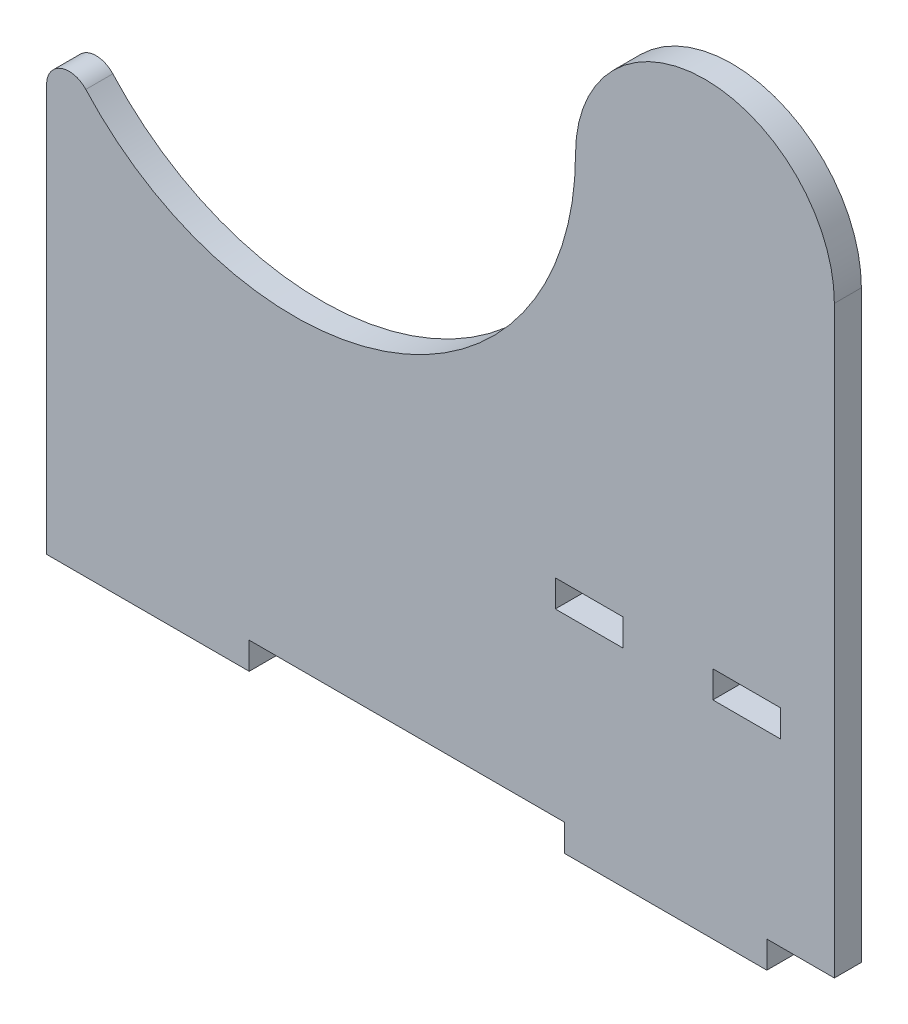
ISO-10303-21;
HEADER;
FILE_DESCRIPTION(('STEP AP214'),'2;1');
FILE_NAME('part.step','',(''),(''),'','','');
FILE_SCHEMA(('AUTOMOTIVE_DESIGN { 1 0 10303 214 1 1 1 1 }'));
ENDSEC;
DATA;
#1=APPLICATION_CONTEXT('core data for automotive mechanical design processes');
#2=APPLICATION_PROTOCOL_DEFINITION('international standard','automotive_design',2000,#1);
#3=PRODUCT_CONTEXT('',#1,'mechanical');
#4=PRODUCT('Part','Part','',(#3));
#5=PRODUCT_RELATED_PRODUCT_CATEGORY('part','',(#4));
#6=PRODUCT_DEFINITION_FORMATION('','',#4);
#7=PRODUCT_DEFINITION_CONTEXT('part definition',#1,'design');
#8=PRODUCT_DEFINITION('design','',#6,#7);
#9=PRODUCT_DEFINITION_SHAPE('','',#8);
#10=(LENGTH_UNIT() NAMED_UNIT(*) SI_UNIT(.MILLI.,.METRE.));
#11=(NAMED_UNIT(*) PLANE_ANGLE_UNIT() SI_UNIT($,.RADIAN.));
#12=(NAMED_UNIT(*) SI_UNIT($,.STERADIAN.) SOLID_ANGLE_UNIT());
#13=UNCERTAINTY_MEASURE_WITH_UNIT(LENGTH_MEASURE(1.E-05),#10,'distance_accuracy_value','');
#14=(GEOMETRIC_REPRESENTATION_CONTEXT(3) GLOBAL_UNCERTAINTY_ASSIGNED_CONTEXT((#13)) GLOBAL_UNIT_ASSIGNED_CONTEXT((#10,
#11,#12)) REPRESENTATION_CONTEXT('',''));
#15=CARTESIAN_POINT('',(0.,0.,0.));
#16=DIRECTION('',(0.,0.,1.));
#17=DIRECTION('',(1.,0.,0.));
#18=AXIS2_PLACEMENT_3D('',#15,#16,#17);
#19=CARTESIAN_POINT('',(91.2507531208354,0.,6.));
#20=DIRECTION('',(0.,0.,-1.));
#21=DIRECTION('',(-1.,0.,0.));
#22=AXIS2_PLACEMENT_3D('',#19,#20,#21);
#23=CYLINDRICAL_SURFACE('',#22,28.7507531208354);
#24=CARTESIAN_POINT('',(91.2507531208354,0.,0.));
#25=DIRECTION('',(0.,0.,1.));
#26=DIRECTION('',(-1.,0.,0.));
#27=AXIS2_PLACEMENT_3D('',#24,#25,#26);
#28=CIRCLE('',#27,28.7507531208354);
#29=CARTESIAN_POINT('',(120.001506241671,0.,0.));
#30=VERTEX_POINT('',#29);
#31=CARTESIAN_POINT('',(62.5,0.,0.));
#32=VERTEX_POINT('',#31);
#33=EDGE_CURVE('E292',#30,#32,#28,.T.);
#34=ORIENTED_EDGE('',*,*,#33,.T.);
#35=DIRECTION('',(0.,0.,-1.));
#36=VECTOR('',#35,1.);
#37=CARTESIAN_POINT('',(62.5,0.,6.));
#38=LINE('',#37,#36);
#39=CARTESIAN_POINT('',(62.5,0.,6.));
#40=VERTEX_POINT('',#39);
#41=EDGE_CURVE('E362',#40,#32,#38,.T.);
#42=ORIENTED_EDGE('',*,*,#41,.F.);
#43=CARTESIAN_POINT('',(91.2507531208354,0.,6.));
#44=DIRECTION('',(0.,0.,1.));
#45=DIRECTION('',(-1.,0.,0.));
#46=AXIS2_PLACEMENT_3D('',#43,#44,#45);
#47=CIRCLE('',#46,28.7507531208354);
#48=CARTESIAN_POINT('',(120.001506241671,0.,6.));
#49=VERTEX_POINT('',#48);
#50=EDGE_CURVE('E249',#49,#40,#47,.T.);
#51=ORIENTED_EDGE('',*,*,#50,.F.);
#52=DIRECTION('',(0.,0.,-1.));
#53=VECTOR('',#52,1.);
#54=CARTESIAN_POINT('',(120.001506241671,0.,6.));
#55=LINE('',#54,#53);
#56=EDGE_CURVE('E291',#49,#30,#55,.T.);
#57=ORIENTED_EDGE('',*,*,#56,.T.);
#58=EDGE_LOOP('',(#34,#42,#51,#57));
#59=FACE_BOUND('',#58,.T.);
#60=ADVANCED_FACE('F41',(#59),#23,.T.);
#61=CARTESIAN_POINT('',(0.,0.,6.));
#62=DIRECTION('',(0.,0.,-1.));
#63=DIRECTION('',(-1.,0.,0.));
#64=AXIS2_PLACEMENT_3D('',#61,#62,#63);
#65=CYLINDRICAL_SURFACE('',#64,62.5);
#66=CARTESIAN_POINT('',(0.,0.,0.));
#67=DIRECTION('',(0.,0.,-1.));
#68=DIRECTION('',(1.,0.,0.));
#69=AXIS2_PLACEMENT_3D('',#66,#67,#68);
#70=CIRCLE('',#69,62.5);
#71=CARTESIAN_POINT('',(-46.2949016280826,-41.9884756004091,0.));
#72=VERTEX_POINT('',#71);
#73=EDGE_CURVE('E296',#32,#72,#70,.T.);
#74=ORIENTED_EDGE('',*,*,#73,.T.);
#75=DIRECTION('',(0.,0.,-1.));
#76=VECTOR('',#75,1.);
#77=CARTESIAN_POINT('',(-46.2949016280826,-41.9884756004091,6.));
#78=LINE('',#77,#76);
#79=CARTESIAN_POINT('',(-46.2949016280826,-41.9884756004091,6.));
#80=VERTEX_POINT('',#79);
#81=EDGE_CURVE('E50',#72,#80,#78,.F.);
#82=ORIENTED_EDGE('',*,*,#81,.T.);
#83=CARTESIAN_POINT('',(0.,0.,6.));
#84=DIRECTION('',(0.,0.,-1.));
#85=DIRECTION('',(1.,0.,0.));
#86=AXIS2_PLACEMENT_3D('',#83,#84,#85);
#87=CIRCLE('',#86,62.5);
#88=EDGE_CURVE('E245',#40,#80,#87,.T.);
#89=ORIENTED_EDGE('',*,*,#88,.F.);
#90=ORIENTED_EDGE('',*,*,#41,.T.);
#91=EDGE_LOOP('',(#74,#82,#89,#90));
#92=FACE_BOUND('',#91,.T.);
#93=ADVANCED_FACE('F458',(#92),#65,.F.);
#94=CARTESIAN_POINT('',(-54.9984937583291,-129.791901429061,6.));
#95=DIRECTION('',(1.,0.,0.));
#96=DIRECTION('',(0.,1.,0.));
#97=AXIS2_PLACEMENT_3D('',#94,#95,#96);
#98=PLANE('',#97);
#99=DIRECTION('',(0.,-1.,0.));
#100=VECTOR('',#99,1.);
#101=CARTESIAN_POINT('',(-54.9984937583291,-29.6886457137241,6.));
#102=LINE('',#101,#100);
#103=CARTESIAN_POINT('',(-54.9984937583291,-45.3475536484419,6.));
#104=VERTEX_POINT('',#103);
#105=CARTESIAN_POINT('',(-54.9984937583291,-135.791901429061,6.));
#106=VERTEX_POINT('',#105);
#107=EDGE_CURVE('E248',#104,#106,#102,.T.);
#108=ORIENTED_EDGE('',*,*,#107,.F.);
#109=DIRECTION('',(0.,0.,-1.));
#110=VECTOR('',#109,1.);
#111=CARTESIAN_POINT('',(-54.9984937583292,-45.3475536484419,6.));
#112=LINE('',#111,#110);
#113=CARTESIAN_POINT('',(-54.9984937583292,-45.3475536484419,0.));
#114=VERTEX_POINT('',#113);
#115=EDGE_CURVE('E392',#104,#114,#112,.T.);
#116=ORIENTED_EDGE('',*,*,#115,.T.);
#117=DIRECTION('',(0.,-1.,0.));
#118=VECTOR('',#117,1.);
#119=CARTESIAN_POINT('',(-54.9984937583291,-129.791901429061,0.));
#120=LINE('',#119,#118);
#121=CARTESIAN_POINT('',(-54.9984937583291,-135.791901429061,0.));
#122=VERTEX_POINT('',#121);
#123=EDGE_CURVE('E300',#114,#122,#120,.T.);
#124=ORIENTED_EDGE('',*,*,#123,.T.);
#125=DIRECTION('',(0.,0.,-1.));
#126=VECTOR('',#125,1.);
#127=CARTESIAN_POINT('',(-54.9984937583291,-135.791901429061,6.));
#128=LINE('',#127,#126);
#129=EDGE_CURVE('E358',#106,#122,#128,.T.);
#130=ORIENTED_EDGE('',*,*,#129,.F.);
#131=EDGE_LOOP('',(#108,#116,#124,#130));
#132=FACE_BOUND('',#131,.T.);
#133=ADVANCED_FACE('F464',(#132),#98,.F.);
#134=CARTESIAN_POINT('',(-54.9984937583291,-135.791901429061,6.));
#135=DIRECTION('',(0.,1.,0.));
#136=DIRECTION('',(-1.,0.,0.));
#137=AXIS2_PLACEMENT_3D('',#134,#135,#136);
#138=PLANE('',#137);
#139=DIRECTION('',(1.,0.,0.));
#140=VECTOR('',#139,1.);
#141=CARTESIAN_POINT('',(-54.9984937583291,-135.791901429061,0.));
#142=LINE('',#141,#140);
#143=CARTESIAN_POINT('',(-9.99849375832913,-135.791901429061,0.));
#144=VERTEX_POINT('',#143);
#145=EDGE_CURVE('E303',#122,#144,#142,.T.);
#146=ORIENTED_EDGE('',*,*,#145,.T.);
#147=DIRECTION('',(0.,0.,-1.));
#148=VECTOR('',#147,1.);
#149=CARTESIAN_POINT('',(-9.99849375832913,-135.791901429061,6.));
#150=LINE('',#149,#148);
#151=CARTESIAN_POINT('',(-9.99849375832913,-135.791901429061,6.));
#152=VERTEX_POINT('',#151);
#153=EDGE_CURVE('E354',#152,#144,#150,.T.);
#154=ORIENTED_EDGE('',*,*,#153,.F.);
#155=DIRECTION('',(1.,0.,0.));
#156=VECTOR('',#155,1.);
#157=CARTESIAN_POINT('',(-54.9984937583291,-135.791901429061,6.));
#158=LINE('',#157,#156);
#159=EDGE_CURVE('E255',#106,#152,#158,.T.);
#160=ORIENTED_EDGE('',*,*,#159,.F.);
#161=ORIENTED_EDGE('',*,*,#129,.T.);
#162=EDGE_LOOP('',(#146,#154,#160,#161));
#163=FACE_BOUND('',#162,.T.);
#164=ADVANCED_FACE('F469',(#163),#138,.F.);
#165=CARTESIAN_POINT('',(-9.99849375832913,-129.791901429061,6.));
#166=DIRECTION('',(-1.,0.,0.));
#167=DIRECTION('',(0.,0.,1.));
#168=AXIS2_PLACEMENT_3D('',#165,#166,#167);
#169=PLANE('',#168);
#170=DIRECTION('',(0.,1.,0.));
#171=VECTOR('',#170,1.);
#172=CARTESIAN_POINT('',(-9.99849375832913,-129.791901429061,0.));
#173=LINE('',#172,#171);
#174=CARTESIAN_POINT('',(-9.99849375832913,-129.791901429061,0.));
#175=VERTEX_POINT('',#174);
#176=EDGE_CURVE('E306',#144,#175,#173,.T.);
#177=ORIENTED_EDGE('',*,*,#176,.T.);
#178=DIRECTION('',(0.,0.,-1.));
#179=VECTOR('',#178,1.);
#180=CARTESIAN_POINT('',(-9.99849375832913,-129.791901429061,6.));
#181=LINE('',#180,#179);
#182=CARTESIAN_POINT('',(-9.99849375832913,-129.791901429061,6.));
#183=VERTEX_POINT('',#182);
#184=EDGE_CURVE('E350',#183,#175,#181,.T.);
#185=ORIENTED_EDGE('',*,*,#184,.F.);
#186=DIRECTION('',(0.,1.,0.));
#187=VECTOR('',#186,1.);
#188=CARTESIAN_POINT('',(-9.99849375832913,-129.791901429061,6.));
#189=LINE('',#188,#187);
#190=EDGE_CURVE('E259',#152,#183,#189,.T.);
#191=ORIENTED_EDGE('',*,*,#190,.F.);
#192=ORIENTED_EDGE('',*,*,#153,.T.);
#193=EDGE_LOOP('',(#177,#185,#191,#192));
#194=FACE_BOUND('',#193,.T.);
#195=ADVANCED_FACE('F473',(#194),#169,.F.);
#196=CARTESIAN_POINT('',(60.0015062416709,-129.791901429061,6.));
#197=DIRECTION('',(0.,1.,0.));
#198=DIRECTION('',(0.,0.,1.));
#199=AXIS2_PLACEMENT_3D('',#196,#197,#198);
#200=PLANE('',#199);
#201=DIRECTION('',(1.,0.,0.));
#202=VECTOR('',#201,1.);
#203=CARTESIAN_POINT('',(60.0015062416709,-129.791901429061,0.));
#204=LINE('',#203,#202);
#205=CARTESIAN_POINT('',(60.0015062416709,-129.791901429061,0.));
#206=VERTEX_POINT('',#205);
#207=EDGE_CURVE('E309',#175,#206,#204,.T.);
#208=ORIENTED_EDGE('',*,*,#207,.T.);
#209=DIRECTION('',(0.,0.,-1.));
#210=VECTOR('',#209,1.);
#211=CARTESIAN_POINT('',(60.0015062416709,-129.791901429061,6.));
#212=LINE('',#211,#210);
#213=CARTESIAN_POINT('',(60.0015062416709,-129.791901429061,6.));
#214=VERTEX_POINT('',#213);
#215=EDGE_CURVE('E346',#214,#206,#212,.T.);
#216=ORIENTED_EDGE('',*,*,#215,.F.);
#217=DIRECTION('',(1.,0.,0.));
#218=VECTOR('',#217,1.);
#219=CARTESIAN_POINT('',(60.0015062416709,-129.791901429061,6.));
#220=LINE('',#219,#218);
#221=EDGE_CURVE('E267',#183,#214,#220,.T.);
#222=ORIENTED_EDGE('',*,*,#221,.F.);
#223=ORIENTED_EDGE('',*,*,#184,.T.);
#224=EDGE_LOOP('',(#208,#216,#222,#223));
#225=FACE_BOUND('',#224,.T.);
#226=ADVANCED_FACE('F477',(#225),#200,.F.);
#227=CARTESIAN_POINT('',(60.0015062416709,-129.791901429061,6.));
#228=DIRECTION('',(1.,0.,0.));
#229=DIRECTION('',(0.,0.,-1.));
#230=AXIS2_PLACEMENT_3D('',#227,#228,#229);
#231=PLANE('',#230);
#232=DIRECTION('',(0.,-1.,0.));
#233=VECTOR('',#232,1.);
#234=CARTESIAN_POINT('',(60.0015062416709,-129.791901429061,0.));
#235=LINE('',#234,#233);
#236=CARTESIAN_POINT('',(60.0015062416709,-135.791901429061,0.));
#237=VERTEX_POINT('',#236);
#238=EDGE_CURVE('E312',#206,#237,#235,.T.);
#239=ORIENTED_EDGE('',*,*,#238,.T.);
#240=DIRECTION('',(0.,0.,-1.));
#241=VECTOR('',#240,1.);
#242=CARTESIAN_POINT('',(60.0015062416709,-135.791901429061,6.));
#243=LINE('',#242,#241);
#244=CARTESIAN_POINT('',(60.0015062416709,-135.791901429061,6.));
#245=VERTEX_POINT('',#244);
#246=EDGE_CURVE('E342',#245,#237,#243,.T.);
#247=ORIENTED_EDGE('',*,*,#246,.F.);
#248=DIRECTION('',(0.,-1.,0.));
#249=VECTOR('',#248,1.);
#250=CARTESIAN_POINT('',(60.0015062416709,-129.791901429061,6.));
#251=LINE('',#250,#249);
#252=EDGE_CURVE('E270',#214,#245,#251,.T.);
#253=ORIENTED_EDGE('',*,*,#252,.F.);
#254=ORIENTED_EDGE('',*,*,#215,.T.);
#255=EDGE_LOOP('',(#239,#247,#253,#254));
#256=FACE_BOUND('',#255,.T.);
#257=ADVANCED_FACE('F481',(#256),#231,.F.);
#258=CARTESIAN_POINT('',(105.001506241671,-135.791901429061,6.));
#259=DIRECTION('',(0.,1.,0.));
#260=DIRECTION('',(-1.,0.,0.));
#261=AXIS2_PLACEMENT_3D('',#258,#259,#260);
#262=PLANE('',#261);
#263=DIRECTION('',(1.,0.,0.));
#264=VECTOR('',#263,1.);
#265=CARTESIAN_POINT('',(105.001506241671,-135.791901429061,0.));
#266=LINE('',#265,#264);
#267=CARTESIAN_POINT('',(105.001506241671,-135.791901429061,0.));
#268=VERTEX_POINT('',#267);
#269=EDGE_CURVE('E315',#237,#268,#266,.T.);
#270=ORIENTED_EDGE('',*,*,#269,.T.);
#271=DIRECTION('',(0.,0.,-1.));
#272=VECTOR('',#271,1.);
#273=CARTESIAN_POINT('',(105.001506241671,-135.791901429061,6.));
#274=LINE('',#273,#272);
#275=CARTESIAN_POINT('',(105.001506241671,-135.791901429061,6.));
#276=VERTEX_POINT('',#275);
#277=EDGE_CURVE('E338',#276,#268,#274,.T.);
#278=ORIENTED_EDGE('',*,*,#277,.F.);
#279=DIRECTION('',(1.,0.,0.));
#280=VECTOR('',#279,1.);
#281=CARTESIAN_POINT('',(105.001506241671,-135.791901429061,6.));
#282=LINE('',#281,#280);
#283=EDGE_CURVE('E274',#245,#276,#282,.T.);
#284=ORIENTED_EDGE('',*,*,#283,.F.);
#285=ORIENTED_EDGE('',*,*,#246,.T.);
#286=EDGE_LOOP('',(#270,#278,#284,#285));
#287=FACE_BOUND('',#286,.T.);
#288=ADVANCED_FACE('F485',(#287),#262,.F.);
#289=CARTESIAN_POINT('',(105.001506241671,-129.791901429061,6.));
#290=DIRECTION('',(-1.,0.,0.));
#291=DIRECTION('',(0.,0.,1.));
#292=AXIS2_PLACEMENT_3D('',#289,#290,#291);
#293=PLANE('',#292);
#294=DIRECTION('',(0.,1.,0.));
#295=VECTOR('',#294,1.);
#296=CARTESIAN_POINT('',(105.001506241671,-129.791901429061,0.));
#297=LINE('',#296,#295);
#298=CARTESIAN_POINT('',(105.001506241671,-129.791901429061,0.));
#299=VERTEX_POINT('',#298);
#300=EDGE_CURVE('E318',#268,#299,#297,.T.);
#301=ORIENTED_EDGE('',*,*,#300,.T.);
#302=DIRECTION('',(0.,0.,-1.));
#303=VECTOR('',#302,1.);
#304=CARTESIAN_POINT('',(105.001506241671,-129.791901429061,6.));
#305=LINE('',#304,#303);
#306=CARTESIAN_POINT('',(105.001506241671,-129.791901429061,6.));
#307=VERTEX_POINT('',#306);
#308=EDGE_CURVE('E334',#307,#299,#305,.T.);
#309=ORIENTED_EDGE('',*,*,#308,.F.);
#310=DIRECTION('',(0.,1.,0.));
#311=VECTOR('',#310,1.);
#312=CARTESIAN_POINT('',(105.001506241671,-129.791901429061,6.));
#313=LINE('',#312,#311);
#314=EDGE_CURVE('E278',#276,#307,#313,.T.);
#315=ORIENTED_EDGE('',*,*,#314,.F.);
#316=ORIENTED_EDGE('',*,*,#277,.T.);
#317=EDGE_LOOP('',(#301,#309,#315,#316));
#318=FACE_BOUND('',#317,.T.);
#319=ADVANCED_FACE('F489',(#318),#293,.F.);
#320=CARTESIAN_POINT('',(105.001506241671,-129.791901429061,6.));
#321=DIRECTION('',(0.,1.,0.));
#322=DIRECTION('',(0.,0.,1.));
#323=AXIS2_PLACEMENT_3D('',#320,#321,#322);
#324=PLANE('',#323);
#325=DIRECTION('',(1.,0.,0.));
#326=VECTOR('',#325,1.);
#327=CARTESIAN_POINT('',(105.001506241671,-129.791901429061,0.));
#328=LINE('',#327,#326);
#329=CARTESIAN_POINT('',(120.001506241671,-129.791901429061,0.));
#330=VERTEX_POINT('',#329);
#331=EDGE_CURVE('E321',#299,#330,#328,.T.);
#332=ORIENTED_EDGE('',*,*,#331,.T.);
#333=DIRECTION('',(0.,0.,-1.));
#334=VECTOR('',#333,1.);
#335=CARTESIAN_POINT('',(120.001506241671,-129.791901429061,6.));
#336=LINE('',#335,#334);
#337=CARTESIAN_POINT('',(120.001506241671,-129.791901429061,6.));
#338=VERTEX_POINT('',#337);
#339=EDGE_CURVE('E330',#338,#330,#336,.T.);
#340=ORIENTED_EDGE('',*,*,#339,.F.);
#341=DIRECTION('',(1.,0.,0.));
#342=VECTOR('',#341,1.);
#343=CARTESIAN_POINT('',(105.001506241671,-129.791901429061,6.));
#344=LINE('',#343,#342);
#345=EDGE_CURVE('E284',#307,#338,#344,.T.);
#346=ORIENTED_EDGE('',*,*,#345,.F.);
#347=ORIENTED_EDGE('',*,*,#308,.T.);
#348=EDGE_LOOP('',(#332,#340,#346,#347));
#349=FACE_BOUND('',#348,.T.);
#350=ADVANCED_FACE('F493',(#349),#324,.F.);
#351=CARTESIAN_POINT('',(120.001506241671,-129.791901429061,6.));
#352=DIRECTION('',(-1.,0.,0.));
#353=DIRECTION('',(0.,0.,1.));
#354=AXIS2_PLACEMENT_3D('',#351,#352,#353);
#355=PLANE('',#354);
#356=DIRECTION('',(0.,1.,0.));
#357=VECTOR('',#356,1.);
#358=CARTESIAN_POINT('',(120.001506241671,-129.791901429061,0.));
#359=LINE('',#358,#357);
#360=EDGE_CURVE('E324',#330,#30,#359,.T.);
#361=ORIENTED_EDGE('',*,*,#360,.T.);
#362=ORIENTED_EDGE('',*,*,#56,.F.);
#363=DIRECTION('',(0.,1.,0.));
#364=VECTOR('',#363,1.);
#365=CARTESIAN_POINT('',(120.001506241671,-129.791901429061,6.));
#366=LINE('',#365,#364);
#367=EDGE_CURVE('E287',#338,#49,#366,.T.);
#368=ORIENTED_EDGE('',*,*,#367,.F.);
#369=ORIENTED_EDGE('',*,*,#339,.T.);
#370=EDGE_LOOP('',(#361,#362,#368,#369));
#371=FACE_BOUND('',#370,.T.);
#372=ADVANCED_FACE('F497',(#371),#355,.F.);
#373=CARTESIAN_POINT('',(91.2507531208354,0.,6.));
#374=DIRECTION('',(0.,0.,-1.));
#375=DIRECTION('',(-1.,0.,0.));
#376=AXIS2_PLACEMENT_3D('',#373,#374,#375);
#377=PLANE('',#376);
#378=DIRECTION('',(0.,-1.,0.));
#379=VECTOR('',#378,1.);
#380=CARTESIAN_POINT('',(58.0015062416708,0.,6.));
#381=LINE('',#380,#379);
#382=CARTESIAN_POINT('',(58.0015062416708,-83.7919014290615,6.));
#383=VERTEX_POINT('',#382);
#384=CARTESIAN_POINT('',(58.0015062416708,-89.7919014290615,6.));
#385=VERTEX_POINT('',#384);
#386=EDGE_CURVE('E194',#383,#385,#381,.T.);
#387=ORIENTED_EDGE('',*,*,#386,.F.);
#388=DIRECTION('',(-1.,0.,0.));
#389=VECTOR('',#388,1.);
#390=CARTESIAN_POINT('',(0.,-83.7919014290615,6.));
#391=LINE('',#390,#389);
#392=CARTESIAN_POINT('',(73.0015062416708,-83.7919014290615,6.));
#393=VERTEX_POINT('',#392);
#394=EDGE_CURVE('E200',#393,#383,#391,.T.);
#395=ORIENTED_EDGE('',*,*,#394,.F.);
#396=DIRECTION('',(0.,-1.,0.));
#397=VECTOR('',#396,1.);
#398=CARTESIAN_POINT('',(73.0015062416708,0.,6.));
#399=LINE('',#398,#397);
#400=CARTESIAN_POINT('',(73.0015062416708,-89.7919014290615,6.));
#401=VERTEX_POINT('',#400);
#402=EDGE_CURVE('E205',#393,#401,#399,.T.);
#403=ORIENTED_EDGE('',*,*,#402,.T.);
#404=DIRECTION('',(-1.,0.,0.));
#405=VECTOR('',#404,1.);
#406=CARTESIAN_POINT('',(0.,-89.7919014290615,6.));
#407=LINE('',#406,#405);
#408=EDGE_CURVE('E182',#401,#385,#407,.T.);
#409=ORIENTED_EDGE('',*,*,#408,.T.);
#410=EDGE_LOOP('',(#387,#395,#403,#409));
#411=FACE_BOUND('',#410,.T.);
#412=DIRECTION('',(0.,-1.,0.));
#413=VECTOR('',#412,1.);
#414=CARTESIAN_POINT('',(93.0015062416709,0.,6.));
#415=LINE('',#414,#413);
#416=CARTESIAN_POINT('',(93.0015062416709,-83.7919014290615,6.));
#417=VERTEX_POINT('',#416);
#418=CARTESIAN_POINT('',(93.0015062416709,-89.7919014290615,6.));
#419=VERTEX_POINT('',#418);
#420=EDGE_CURVE('E223',#417,#419,#415,.T.);
#421=ORIENTED_EDGE('',*,*,#420,.F.);
#422=DIRECTION('',(-1.,0.,0.));
#423=VECTOR('',#422,1.);
#424=CARTESIAN_POINT('',(0.,-83.7919014290615,6.));
#425=LINE('',#424,#423);
#426=CARTESIAN_POINT('',(108.001506241671,-83.7919014290615,6.));
#427=VERTEX_POINT('',#426);
#428=EDGE_CURVE('E229',#427,#417,#425,.T.);
#429=ORIENTED_EDGE('',*,*,#428,.F.);
#430=DIRECTION('',(0.,-1.,0.));
#431=VECTOR('',#430,1.);
#432=CARTESIAN_POINT('',(108.001506241671,0.,6.));
#433=LINE('',#432,#431);
#434=CARTESIAN_POINT('',(108.001506241671,-89.7919014290615,6.));
#435=VERTEX_POINT('',#434);
#436=EDGE_CURVE('E236',#427,#435,#433,.T.);
#437=ORIENTED_EDGE('',*,*,#436,.T.);
#438=DIRECTION('',(-1.,0.,0.));
#439=VECTOR('',#438,1.);
#440=CARTESIAN_POINT('',(0.,-89.7919014290615,6.));
#441=LINE('',#440,#439);
#442=EDGE_CURVE('E228',#435,#419,#441,.T.);
#443=ORIENTED_EDGE('',*,*,#442,.T.);
#444=EDGE_LOOP('',(#421,#429,#437,#443));
#445=FACE_BOUND('',#444,.T.);
#446=ORIENTED_EDGE('',*,*,#88,.T.);
#447=CARTESIAN_POINT('',(-49.9984937583292,-45.3475536484419,6.));
#448=DIRECTION('',(0.,0.,-1.));
#449=DIRECTION('',(-1.,0.,0.));
#450=AXIS2_PLACEMENT_3D('',#447,#448,#449);
#451=CIRCLE('',#450,5.);
#452=EDGE_CURVE('E12',#80,#104,#451,.F.);
#453=ORIENTED_EDGE('',*,*,#452,.T.);
#454=ORIENTED_EDGE('',*,*,#107,.T.);
#455=ORIENTED_EDGE('',*,*,#159,.T.);
#456=ORIENTED_EDGE('',*,*,#190,.T.);
#457=ORIENTED_EDGE('',*,*,#221,.T.);
#458=ORIENTED_EDGE('',*,*,#252,.T.);
#459=ORIENTED_EDGE('',*,*,#283,.T.);
#460=ORIENTED_EDGE('',*,*,#314,.T.);
#461=ORIENTED_EDGE('',*,*,#345,.T.);
#462=ORIENTED_EDGE('',*,*,#367,.T.);
#463=ORIENTED_EDGE('',*,*,#50,.T.);
#464=EDGE_LOOP('',(#446,#453,#454,#455,#456,#457,#458,#459,#460,#461,#462,#463));
#465=FACE_BOUND('',#464,.T.);
#466=ADVANCED_FACE('F202',(#411,#445,#465),#377,.F.);
#467=CARTESIAN_POINT('',(91.2507531208354,0.,0.));
#468=DIRECTION('',(0.,0.,-1.));
#469=DIRECTION('',(-1.,0.,0.));
#470=AXIS2_PLACEMENT_3D('',#467,#468,#469);
#471=PLANE('',#470);
#472=DIRECTION('',(1.,0.,0.));
#473=VECTOR('',#472,1.);
#474=CARTESIAN_POINT('',(91.2507531208354,-83.7919014290615,0.));
#475=LINE('',#474,#473);
#476=CARTESIAN_POINT('',(58.0015062416708,-83.7919014290615,0.));
#477=VERTEX_POINT('',#476);
#478=CARTESIAN_POINT('',(73.0015062416708,-83.7919014290615,0.));
#479=VERTEX_POINT('',#478);
#480=EDGE_CURVE('E389',#477,#479,#475,.T.);
#481=ORIENTED_EDGE('',*,*,#480,.F.);
#482=DIRECTION('',(0.,1.,0.));
#483=VECTOR('',#482,1.);
#484=CARTESIAN_POINT('',(58.0015062416708,0.,0.));
#485=LINE('',#484,#483);
#486=CARTESIAN_POINT('',(58.0015062416708,-89.7919014290615,0.));
#487=VERTEX_POINT('',#486);
#488=EDGE_CURVE('E380',#487,#477,#485,.T.);
#489=ORIENTED_EDGE('',*,*,#488,.F.);
#490=DIRECTION('',(1.,0.,0.));
#491=VECTOR('',#490,1.);
#492=CARTESIAN_POINT('',(91.2507531208354,-89.7919014290615,0.));
#493=LINE('',#492,#491);
#494=CARTESIAN_POINT('',(73.0015062416708,-89.7919014290615,0.));
#495=VERTEX_POINT('',#494);
#496=EDGE_CURVE('E185',#487,#495,#493,.T.);
#497=ORIENTED_EDGE('',*,*,#496,.T.);
#498=DIRECTION('',(0.,1.,0.));
#499=VECTOR('',#498,1.);
#500=CARTESIAN_POINT('',(73.0015062416708,0.,0.));
#501=LINE('',#500,#499);
#502=EDGE_CURVE('E385',#495,#479,#501,.T.);
#503=ORIENTED_EDGE('',*,*,#502,.T.);
#504=EDGE_LOOP('',(#481,#489,#497,#503));
#505=FACE_BOUND('',#504,.T.);
#506=DIRECTION('',(1.,0.,0.));
#507=VECTOR('',#506,1.);
#508=CARTESIAN_POINT('',(91.2507531208354,-83.7919014290615,0.));
#509=LINE('',#508,#507);
#510=CARTESIAN_POINT('',(93.0015062416709,-83.7919014290615,0.));
#511=VERTEX_POINT('',#510);
#512=CARTESIAN_POINT('',(108.001506241671,-83.7919014290615,0.));
#513=VERTEX_POINT('',#512);
#514=EDGE_CURVE('E377',#511,#513,#509,.T.);
#515=ORIENTED_EDGE('',*,*,#514,.F.);
#516=DIRECTION('',(0.,1.,0.));
#517=VECTOR('',#516,1.);
#518=CARTESIAN_POINT('',(93.0015062416709,0.,0.));
#519=LINE('',#518,#517);
#520=CARTESIAN_POINT('',(93.0015062416709,-89.7919014290615,0.));
#521=VERTEX_POINT('',#520);
#522=EDGE_CURVE('E366',#521,#511,#519,.T.);
#523=ORIENTED_EDGE('',*,*,#522,.F.);
#524=DIRECTION('',(1.,0.,0.));
#525=VECTOR('',#524,1.);
#526=CARTESIAN_POINT('',(91.2507531208354,-89.7919014290615,0.));
#527=LINE('',#526,#525);
#528=CARTESIAN_POINT('',(108.001506241671,-89.7919014290615,0.));
#529=VERTEX_POINT('',#528);
#530=EDGE_CURVE('E369',#521,#529,#527,.T.);
#531=ORIENTED_EDGE('',*,*,#530,.T.);
#532=DIRECTION('',(0.,1.,0.));
#533=VECTOR('',#532,1.);
#534=CARTESIAN_POINT('',(108.001506241671,0.,0.));
#535=LINE('',#534,#533);
#536=EDGE_CURVE('E373',#529,#513,#535,.T.);
#537=ORIENTED_EDGE('',*,*,#536,.T.);
#538=EDGE_LOOP('',(#515,#523,#531,#537));
#539=FACE_BOUND('',#538,.T.);
#540=ORIENTED_EDGE('',*,*,#123,.F.);
#541=CARTESIAN_POINT('',(-49.9984937583292,-45.3475536484419,0.));
#542=DIRECTION('',(0.,0.,-1.));
#543=DIRECTION('',(-1.,0.,0.));
#544=AXIS2_PLACEMENT_3D('',#541,#542,#543);
#545=CIRCLE('',#544,5.);
#546=EDGE_CURVE('E64',#114,#72,#545,.T.);
#547=ORIENTED_EDGE('',*,*,#546,.T.);
#548=ORIENTED_EDGE('',*,*,#73,.F.);
#549=ORIENTED_EDGE('',*,*,#33,.F.);
#550=ORIENTED_EDGE('',*,*,#360,.F.);
#551=ORIENTED_EDGE('',*,*,#331,.F.);
#552=ORIENTED_EDGE('',*,*,#300,.F.);
#553=ORIENTED_EDGE('',*,*,#269,.F.);
#554=ORIENTED_EDGE('',*,*,#238,.F.);
#555=ORIENTED_EDGE('',*,*,#207,.F.);
#556=ORIENTED_EDGE('',*,*,#176,.F.);
#557=ORIENTED_EDGE('',*,*,#145,.F.);
#558=EDGE_LOOP('',(#540,#547,#548,#549,#550,#551,#552,#553,#554,#555,#556,#557));
#559=FACE_BOUND('',#558,.T.);
#560=ADVANCED_FACE('F411',(#505,#539,#559),#471,.T.);
#561=CARTESIAN_POINT('',(0.,-83.7919014290615,-4.));
#562=DIRECTION('',(0.,1.,0.));
#563=DIRECTION('',(0.,0.,1.));
#564=AXIS2_PLACEMENT_3D('',#561,#562,#563);
#565=PLANE('',#564);
#566=ORIENTED_EDGE('',*,*,#514,.T.);
#567=DIRECTION('',(0.,0.,1.));
#568=VECTOR('',#567,1.);
#569=CARTESIAN_POINT('',(108.001506241671,-83.7919014290615,-4.));
#570=LINE('',#569,#568);
#571=EDGE_CURVE('E416',#513,#427,#570,.T.);
#572=ORIENTED_EDGE('',*,*,#571,.T.);
#573=ORIENTED_EDGE('',*,*,#428,.T.);
#574=DIRECTION('',(0.,0.,1.));
#575=VECTOR('',#574,1.);
#576=CARTESIAN_POINT('',(93.0015062416709,-83.7919014290615,-4.));
#577=LINE('',#576,#575);
#578=EDGE_CURVE('E429',#511,#417,#577,.T.);
#579=ORIENTED_EDGE('',*,*,#578,.F.);
#580=EDGE_LOOP('',(#566,#572,#573,#579));
#581=FACE_BOUND('',#580,.T.);
#582=ADVANCED_FACE('F504',(#581),#565,.F.);
#583=CARTESIAN_POINT('',(108.001506241671,0.,-4.));
#584=DIRECTION('',(-1.,0.,0.));
#585=DIRECTION('',(0.,0.,1.));
#586=AXIS2_PLACEMENT_3D('',#583,#584,#585);
#587=PLANE('',#586);
#588=DIRECTION('',(0.,0.,1.));
#589=VECTOR('',#588,1.);
#590=CARTESIAN_POINT('',(108.001506241671,-89.7919014290615,-4.));
#591=LINE('',#590,#589);
#592=EDGE_CURVE('E418',#529,#435,#591,.T.);
#593=ORIENTED_EDGE('',*,*,#592,.T.);
#594=ORIENTED_EDGE('',*,*,#436,.F.);
#595=ORIENTED_EDGE('',*,*,#571,.F.);
#596=ORIENTED_EDGE('',*,*,#536,.F.);
#597=EDGE_LOOP('',(#593,#594,#595,#596));
#598=FACE_BOUND('',#597,.T.);
#599=ADVANCED_FACE('F441',(#598),#587,.T.);
#600=CARTESIAN_POINT('',(0.,-89.7919014290615,-4.));
#601=DIRECTION('',(0.,1.,0.));
#602=DIRECTION('',(0.,0.,1.));
#603=AXIS2_PLACEMENT_3D('',#600,#601,#602);
#604=PLANE('',#603);
#605=DIRECTION('',(0.,0.,1.));
#606=VECTOR('',#605,1.);
#607=CARTESIAN_POINT('',(93.0015062416709,-89.7919014290615,-4.));
#608=LINE('',#607,#606);
#609=EDGE_CURVE('E425',#521,#419,#608,.T.);
#610=ORIENTED_EDGE('',*,*,#609,.T.);
#611=ORIENTED_EDGE('',*,*,#442,.F.);
#612=ORIENTED_EDGE('',*,*,#592,.F.);
#613=ORIENTED_EDGE('',*,*,#530,.F.);
#614=EDGE_LOOP('',(#610,#611,#612,#613));
#615=FACE_BOUND('',#614,.T.);
#616=ADVANCED_FACE('F445',(#615),#604,.T.);
#617=CARTESIAN_POINT('',(93.0015062416709,0.,-4.));
#618=DIRECTION('',(-1.,0.,0.));
#619=DIRECTION('',(0.,0.,1.));
#620=AXIS2_PLACEMENT_3D('',#617,#618,#619);
#621=PLANE('',#620);
#622=ORIENTED_EDGE('',*,*,#522,.T.);
#623=ORIENTED_EDGE('',*,*,#578,.T.);
#624=ORIENTED_EDGE('',*,*,#420,.T.);
#625=ORIENTED_EDGE('',*,*,#609,.F.);
#626=EDGE_LOOP('',(#622,#623,#624,#625));
#627=FACE_BOUND('',#626,.T.);
#628=ADVANCED_FACE('F447',(#627),#621,.F.);
#629=CARTESIAN_POINT('',(0.,-83.7919014290615,-4.));
#630=DIRECTION('',(0.,1.,0.));
#631=DIRECTION('',(0.,0.,1.));
#632=AXIS2_PLACEMENT_3D('',#629,#630,#631);
#633=PLANE('',#632);
#634=ORIENTED_EDGE('',*,*,#480,.T.);
#635=DIRECTION('',(0.,0.,1.));
#636=VECTOR('',#635,1.);
#637=CARTESIAN_POINT('',(73.0015062416708,-83.7919014290615,-4.));
#638=LINE('',#637,#636);
#639=EDGE_CURVE('E297',#479,#393,#638,.T.);
#640=ORIENTED_EDGE('',*,*,#639,.T.);
#641=ORIENTED_EDGE('',*,*,#394,.T.);
#642=DIRECTION('',(0.,0.,1.));
#643=VECTOR('',#642,1.);
#644=CARTESIAN_POINT('',(58.0015062416708,-83.7919014290615,-4.));
#645=LINE('',#644,#643);
#646=EDGE_CURVE('E190',#477,#383,#645,.T.);
#647=ORIENTED_EDGE('',*,*,#646,.F.);
#648=EDGE_LOOP('',(#634,#640,#641,#647));
#649=FACE_BOUND('',#648,.T.);
#650=ADVANCED_FACE('F414',(#649),#633,.F.);
#651=CARTESIAN_POINT('',(73.0015062416708,0.,-4.));
#652=DIRECTION('',(-1.,0.,0.));
#653=DIRECTION('',(0.,0.,1.));
#654=AXIS2_PLACEMENT_3D('',#651,#652,#653);
#655=PLANE('',#654);
#656=DIRECTION('',(0.,0.,1.));
#657=VECTOR('',#656,1.);
#658=CARTESIAN_POINT('',(73.0015062416708,-89.7919014290615,-4.));
#659=LINE('',#658,#657);
#660=EDGE_CURVE('E189',#495,#401,#659,.T.);
#661=ORIENTED_EDGE('',*,*,#660,.T.);
#662=ORIENTED_EDGE('',*,*,#402,.F.);
#663=ORIENTED_EDGE('',*,*,#639,.F.);
#664=ORIENTED_EDGE('',*,*,#502,.F.);
#665=EDGE_LOOP('',(#661,#662,#663,#664));
#666=FACE_BOUND('',#665,.T.);
#667=ADVANCED_FACE('F407',(#666),#655,.T.);
#668=CARTESIAN_POINT('',(0.,-89.7919014290615,-4.));
#669=DIRECTION('',(0.,1.,0.));
#670=DIRECTION('',(0.,0.,1.));
#671=AXIS2_PLACEMENT_3D('',#668,#669,#670);
#672=PLANE('',#671);
#673=DIRECTION('',(0.,0.,1.));
#674=VECTOR('',#673,1.);
#675=CARTESIAN_POINT('',(58.0015062416708,-89.7919014290615,-4.));
#676=LINE('',#675,#674);
#677=EDGE_CURVE('E177',#487,#385,#676,.T.);
#678=ORIENTED_EDGE('',*,*,#677,.T.);
#679=ORIENTED_EDGE('',*,*,#408,.F.);
#680=ORIENTED_EDGE('',*,*,#660,.F.);
#681=ORIENTED_EDGE('',*,*,#496,.F.);
#682=EDGE_LOOP('',(#678,#679,#680,#681));
#683=FACE_BOUND('',#682,.T.);
#684=ADVANCED_FACE('F179',(#683),#672,.T.);
#685=CARTESIAN_POINT('',(58.0015062416708,0.,-4.));
#686=DIRECTION('',(-1.,0.,0.));
#687=DIRECTION('',(0.,0.,1.));
#688=AXIS2_PLACEMENT_3D('',#685,#686,#687);
#689=PLANE('',#688);
#690=ORIENTED_EDGE('',*,*,#488,.T.);
#691=ORIENTED_EDGE('',*,*,#646,.T.);
#692=ORIENTED_EDGE('',*,*,#386,.T.);
#693=ORIENTED_EDGE('',*,*,#677,.F.);
#694=EDGE_LOOP('',(#690,#691,#692,#693));
#695=FACE_BOUND('',#694,.T.);
#696=ADVANCED_FACE('F195',(#695),#689,.F.);
#697=CARTESIAN_POINT('',(-49.9984937583292,-45.3475536484419,6.));
#698=DIRECTION('',(0.,0.,-1.));
#699=DIRECTION('',(-1.,0.,0.));
#700=AXIS2_PLACEMENT_3D('',#697,#698,#699);
#701=CYLINDRICAL_SURFACE('',#700,5.);
#702=ORIENTED_EDGE('',*,*,#452,.F.);
#703=ORIENTED_EDGE('',*,*,#81,.F.);
#704=ORIENTED_EDGE('',*,*,#546,.F.);
#705=ORIENTED_EDGE('',*,*,#115,.F.);
#706=EDGE_LOOP('',(#702,#703,#704,#705));
#707=FACE_BOUND('',#706,.T.);
#708=ADVANCED_FACE('F43',(#707),#701,.T.);
#709=CLOSED_SHELL('',(#60,#93,#133,#164,#195,#226,#257,#288,#319,#350,#372,#466,#560,#582,#599,
#616,#628,#650,#667,#684,#696,#708));
#710=MANIFOLD_SOLID_BREP('B2',#709);
#711=ADVANCED_BREP_SHAPE_REPRESENTATION('',(#18,#710),#14);
#712=SHAPE_DEFINITION_REPRESENTATION(#9,#711);
ENDSEC;
END-ISO-10303-21;
